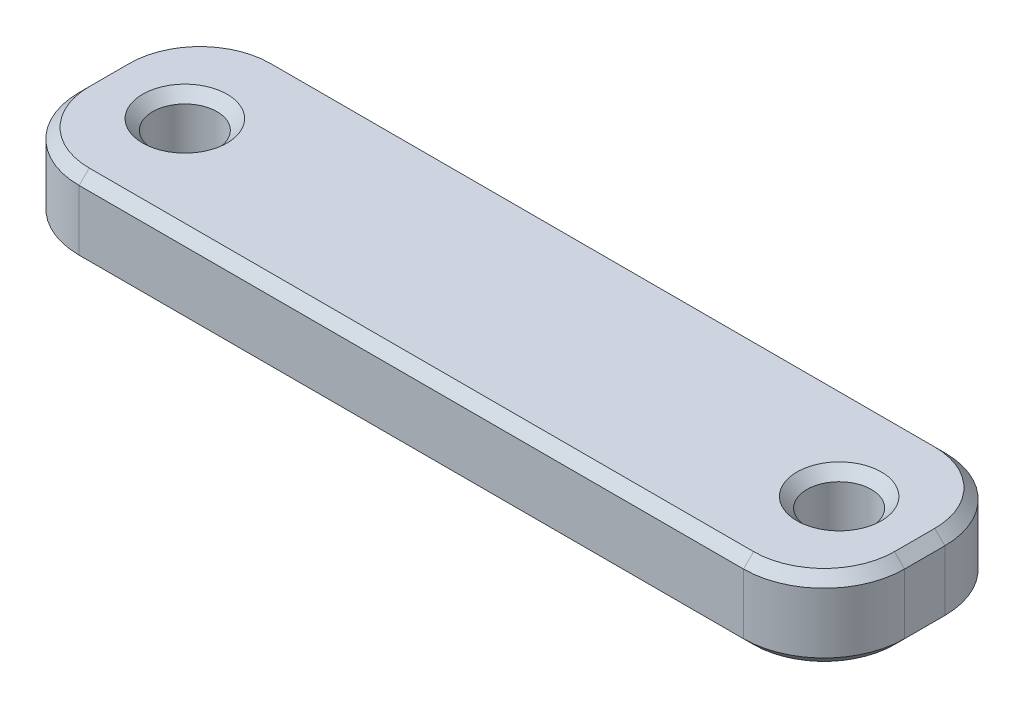
ISO-10303-21;
HEADER;
FILE_DESCRIPTION(('STEP AP214'),'2;1');
FILE_NAME('part.step','',(''),(''),'','','');
FILE_SCHEMA(('AUTOMOTIVE_DESIGN { 1 0 10303 214 1 1 1 1 }'));
ENDSEC;
DATA;
#1=APPLICATION_CONTEXT('core data for automotive mechanical design processes');
#2=APPLICATION_PROTOCOL_DEFINITION('international standard','automotive_design',2000,#1);
#3=PRODUCT_CONTEXT('',#1,'mechanical');
#4=PRODUCT('Part','Part','',(#3));
#5=PRODUCT_RELATED_PRODUCT_CATEGORY('part','',(#4));
#6=PRODUCT_DEFINITION_FORMATION('','',#4);
#7=PRODUCT_DEFINITION_CONTEXT('part definition',#1,'design');
#8=PRODUCT_DEFINITION('design','',#6,#7);
#9=PRODUCT_DEFINITION_SHAPE('','',#8);
#10=(LENGTH_UNIT() NAMED_UNIT(*) SI_UNIT(.MILLI.,.METRE.));
#11=(NAMED_UNIT(*) PLANE_ANGLE_UNIT() SI_UNIT($,.RADIAN.));
#12=(NAMED_UNIT(*) SI_UNIT($,.STERADIAN.) SOLID_ANGLE_UNIT());
#13=UNCERTAINTY_MEASURE_WITH_UNIT(LENGTH_MEASURE(1.E-05),#10,'distance_accuracy_value','');
#14=(GEOMETRIC_REPRESENTATION_CONTEXT(3) GLOBAL_UNCERTAINTY_ASSIGNED_CONTEXT((#13)) GLOBAL_UNIT_ASSIGNED_CONTEXT((#10,
#11,#12)) REPRESENTATION_CONTEXT('',''));
#15=CARTESIAN_POINT('',(0.,0.,0.));
#16=DIRECTION('',(0.,0.,1.));
#17=DIRECTION('',(1.,0.,0.));
#18=AXIS2_PLACEMENT_3D('',#15,#16,#17);
#19=CARTESIAN_POINT('',(0.,4.,0.));
#20=DIRECTION('',(0.,1.,0.));
#21=DIRECTION('',(0.,0.,1.));
#22=AXIS2_PLACEMENT_3D('',#19,#20,#21);
#23=PLANE('',#22);
#24=CARTESIAN_POINT('',(16.25,4.,0.));
#25=DIRECTION('',(0.,1.,0.));
#26=DIRECTION('',(0.,0.,1.));
#27=AXIS2_PLACEMENT_3D('',#24,#25,#26);
#28=CIRCLE('',#27,2.1);
#29=CARTESIAN_POINT('',(16.25,4.,2.1));
#30=VERTEX_POINT('',#29);
#31=EDGE_CURVE('E11',#30,#30,#28,.F.);
#32=ORIENTED_EDGE('',*,*,#31,.T.);
#33=EDGE_LOOP('',(#32));
#34=FACE_BOUND('',#33,.T.);
#35=DIRECTION('',(1.,0.,0.));
#36=VECTOR('',#35,1.);
#37=CARTESIAN_POINT('',(16.5,4.,4.5));
#38=LINE('',#37,#36);
#39=CARTESIAN_POINT('',(-16.5,4.,4.5));
#40=VERTEX_POINT('',#39);
#41=CARTESIAN_POINT('',(16.5,4.,4.5));
#42=VERTEX_POINT('',#41);
#43=EDGE_CURVE('E63',#40,#42,#38,.T.);
#44=ORIENTED_EDGE('',*,*,#43,.T.);
#45=CARTESIAN_POINT('',(16.5,4.,1.));
#46=DIRECTION('',(0.,1.,0.));
#47=DIRECTION('',(0.,0.,1.));
#48=AXIS2_PLACEMENT_3D('',#45,#46,#47);
#49=CIRCLE('',#48,3.5);
#50=CARTESIAN_POINT('',(20.,4.,1.));
#51=VERTEX_POINT('',#50);
#52=EDGE_CURVE('E57',#42,#51,#49,.T.);
#53=ORIENTED_EDGE('',*,*,#52,.T.);
#54=DIRECTION('',(0.,0.,-1.));
#55=VECTOR('',#54,1.);
#56=CARTESIAN_POINT('',(20.,4.,-0.999999999999999));
#57=LINE('',#56,#55);
#58=CARTESIAN_POINT('',(20.,4.,-0.999999999999999));
#59=VERTEX_POINT('',#58);
#60=EDGE_CURVE('E274',#51,#59,#57,.T.);
#61=ORIENTED_EDGE('',*,*,#60,.T.);
#62=CARTESIAN_POINT('',(16.5,4.,-0.999999999999999));
#63=DIRECTION('',(0.,1.,0.));
#64=DIRECTION('',(0.,0.,1.));
#65=AXIS2_PLACEMENT_3D('',#62,#63,#64);
#66=CIRCLE('',#65,3.5);
#67=CARTESIAN_POINT('',(16.5,4.,-4.5));
#68=VERTEX_POINT('',#67);
#69=EDGE_CURVE('E279',#59,#68,#66,.T.);
#70=ORIENTED_EDGE('',*,*,#69,.T.);
#71=DIRECTION('',(-1.,0.,0.));
#72=VECTOR('',#71,1.);
#73=CARTESIAN_POINT('',(-16.5,4.,-4.5));
#74=LINE('',#73,#72);
#75=CARTESIAN_POINT('',(-16.5,4.,-4.5));
#76=VERTEX_POINT('',#75);
#77=EDGE_CURVE('E284',#68,#76,#74,.T.);
#78=ORIENTED_EDGE('',*,*,#77,.T.);
#79=CARTESIAN_POINT('',(-16.5,4.,-0.999999999999999));
#80=DIRECTION('',(0.,1.,0.));
#81=DIRECTION('',(0.,0.,1.));
#82=AXIS2_PLACEMENT_3D('',#79,#80,#81);
#83=CIRCLE('',#82,3.5);
#84=CARTESIAN_POINT('',(-20.,4.,-0.999999999999998));
#85=VERTEX_POINT('',#84);
#86=EDGE_CURVE('E283',#76,#85,#83,.T.);
#87=ORIENTED_EDGE('',*,*,#86,.T.);
#88=DIRECTION('',(0.,0.,1.));
#89=VECTOR('',#88,1.);
#90=CARTESIAN_POINT('',(-20.,4.,1.));
#91=LINE('',#90,#89);
#92=CARTESIAN_POINT('',(-20.,4.,1.));
#93=VERTEX_POINT('',#92);
#94=EDGE_CURVE('E289',#85,#93,#91,.T.);
#95=ORIENTED_EDGE('',*,*,#94,.T.);
#96=CARTESIAN_POINT('',(-16.5,4.,1.));
#97=DIRECTION('',(0.,1.,0.));
#98=DIRECTION('',(0.,0.,1.));
#99=AXIS2_PLACEMENT_3D('',#96,#97,#98);
#100=CIRCLE('',#99,3.5);
#101=EDGE_CURVE('E66',#93,#40,#100,.T.);
#102=ORIENTED_EDGE('',*,*,#101,.T.);
#103=EDGE_LOOP('',(#44,#53,#61,#70,#78,#87,#95,#102));
#104=FACE_BOUND('',#103,.T.);
#105=CARTESIAN_POINT('',(-16.25,4.,0.));
#106=DIRECTION('',(0.,1.,0.));
#107=DIRECTION('',(0.,0.,1.));
#108=AXIS2_PLACEMENT_3D('',#105,#106,#107);
#109=CIRCLE('',#108,2.10000000000002);
#110=CARTESIAN_POINT('',(-16.25,4.,2.10000000000002));
#111=VERTEX_POINT('',#110);
#112=EDGE_CURVE('E271',#111,#111,#109,.F.);
#113=ORIENTED_EDGE('',*,*,#112,.T.);
#114=EDGE_LOOP('',(#113));
#115=FACE_BOUND('',#114,.T.);
#116=ADVANCED_FACE('F44',(#34,#104,#115),#23,.T.);
#117=CARTESIAN_POINT('',(0.,0.,0.));
#118=DIRECTION('',(0.,1.,0.));
#119=DIRECTION('',(0.,0.,1.));
#120=AXIS2_PLACEMENT_3D('',#117,#118,#119);
#121=PLANE('',#120);
#122=CARTESIAN_POINT('',(16.25,0.,0.));
#123=DIRECTION('',(0.,1.,0.));
#124=DIRECTION('',(0.,0.,1.));
#125=AXIS2_PLACEMENT_3D('',#122,#123,#124);
#126=CIRCLE('',#125,2.1);
#127=CARTESIAN_POINT('',(16.25,0.,2.1));
#128=VERTEX_POINT('',#127);
#129=EDGE_CURVE('E197',#128,#128,#126,.T.);
#130=ORIENTED_EDGE('',*,*,#129,.T.);
#131=EDGE_LOOP('',(#130));
#132=FACE_BOUND('',#131,.T.);
#133=CARTESIAN_POINT('',(-16.25,0.,0.));
#134=DIRECTION('',(0.,1.,0.));
#135=DIRECTION('',(0.,0.,1.));
#136=AXIS2_PLACEMENT_3D('',#133,#134,#135);
#137=CIRCLE('',#136,2.1);
#138=CARTESIAN_POINT('',(-16.25,0.,2.1));
#139=VERTEX_POINT('',#138);
#140=EDGE_CURVE('E192',#139,#139,#137,.T.);
#141=ORIENTED_EDGE('',*,*,#140,.T.);
#142=EDGE_LOOP('',(#141));
#143=FACE_BOUND('',#142,.T.);
#144=DIRECTION('',(0.,0.,-1.));
#145=VECTOR('',#144,1.);
#146=CARTESIAN_POINT('',(-20.,0.,0.));
#147=LINE('',#146,#145);
#148=CARTESIAN_POINT('',(-20.,0.,1.));
#149=VERTEX_POINT('',#148);
#150=CARTESIAN_POINT('',(-20.,0.,-0.999999999999998));
#151=VERTEX_POINT('',#150);
#152=EDGE_CURVE('E190',#149,#151,#147,.T.);
#153=ORIENTED_EDGE('',*,*,#152,.T.);
#154=CARTESIAN_POINT('',(-16.5,0.,-0.999999999999999));
#155=DIRECTION('',(0.,1.,0.));
#156=DIRECTION('',(0.,0.,1.));
#157=AXIS2_PLACEMENT_3D('',#154,#155,#156);
#158=CIRCLE('',#157,3.5);
#159=CARTESIAN_POINT('',(-16.5,0.,-4.5));
#160=VERTEX_POINT('',#159);
#161=EDGE_CURVE('E170',#151,#160,#158,.F.);
#162=ORIENTED_EDGE('',*,*,#161,.T.);
#163=DIRECTION('',(1.,0.,0.));
#164=VECTOR('',#163,1.);
#165=CARTESIAN_POINT('',(0.,0.,-4.5));
#166=LINE('',#165,#164);
#167=CARTESIAN_POINT('',(16.5,0.,-4.5));
#168=VERTEX_POINT('',#167);
#169=EDGE_CURVE('E177',#160,#168,#166,.T.);
#170=ORIENTED_EDGE('',*,*,#169,.T.);
#171=CARTESIAN_POINT('',(16.5,0.,-0.999999999999999));
#172=DIRECTION('',(0.,1.,0.));
#173=DIRECTION('',(0.,0.,1.));
#174=AXIS2_PLACEMENT_3D('',#171,#172,#173);
#175=CIRCLE('',#174,3.5);
#176=CARTESIAN_POINT('',(20.,0.,-0.999999999999999));
#177=VERTEX_POINT('',#176);
#178=EDGE_CURVE('E181',#168,#177,#175,.F.);
#179=ORIENTED_EDGE('',*,*,#178,.T.);
#180=DIRECTION('',(0.,0.,1.));
#181=VECTOR('',#180,1.);
#182=CARTESIAN_POINT('',(20.,0.,0.));
#183=LINE('',#182,#181);
#184=CARTESIAN_POINT('',(20.,0.,1.));
#185=VERTEX_POINT('',#184);
#186=EDGE_CURVE('E398',#177,#185,#183,.T.);
#187=ORIENTED_EDGE('',*,*,#186,.T.);
#188=CARTESIAN_POINT('',(16.5,0.,1.));
#189=DIRECTION('',(0.,1.,0.));
#190=DIRECTION('',(0.,0.,1.));
#191=AXIS2_PLACEMENT_3D('',#188,#189,#190);
#192=CIRCLE('',#191,3.5);
#193=CARTESIAN_POINT('',(16.5,0.,4.5));
#194=VERTEX_POINT('',#193);
#195=EDGE_CURVE('E401',#185,#194,#192,.F.);
#196=ORIENTED_EDGE('',*,*,#195,.T.);
#197=DIRECTION('',(-1.,0.,0.));
#198=VECTOR('',#197,1.);
#199=CARTESIAN_POINT('',(0.,0.,4.5));
#200=LINE('',#199,#198);
#201=CARTESIAN_POINT('',(-16.5,0.,4.5));
#202=VERTEX_POINT('',#201);
#203=EDGE_CURVE('E409',#194,#202,#200,.T.);
#204=ORIENTED_EDGE('',*,*,#203,.T.);
#205=CARTESIAN_POINT('',(-16.5,0.,1.));
#206=DIRECTION('',(0.,1.,0.));
#207=DIRECTION('',(0.,0.,1.));
#208=AXIS2_PLACEMENT_3D('',#205,#206,#207);
#209=CIRCLE('',#208,3.5);
#210=EDGE_CURVE('E199',#202,#149,#209,.F.);
#211=ORIENTED_EDGE('',*,*,#210,.T.);
#212=EDGE_LOOP('',(#153,#162,#170,#179,#187,#196,#204,#211));
#213=FACE_BOUND('',#212,.T.);
#214=ADVANCED_FACE('F189',(#132,#143,#213),#121,.F.);
#215=CARTESIAN_POINT('',(20.5,4.,-5.));
#216=DIRECTION('',(-1.,0.,0.));
#217=DIRECTION('',(0.,0.,1.));
#218=AXIS2_PLACEMENT_3D('',#215,#216,#217);
#219=PLANE('',#218);
#220=DIRECTION('',(0.,-1.,0.));
#221=VECTOR('',#220,1.);
#222=CARTESIAN_POINT('',(20.5,4.,1.));
#223=LINE('',#222,#221);
#224=CARTESIAN_POINT('',(20.5,3.5,1.));
#225=VERTEX_POINT('',#224);
#226=CARTESIAN_POINT('',(20.5,0.5,1.));
#227=VERTEX_POINT('',#226);
#228=EDGE_CURVE('E376',#225,#227,#223,.T.);
#229=ORIENTED_EDGE('',*,*,#228,.T.);
#230=DIRECTION('',(0.,0.,-1.));
#231=VECTOR('',#230,1.);
#232=CARTESIAN_POINT('',(20.5,0.5,-5.));
#233=LINE('',#232,#231);
#234=CARTESIAN_POINT('',(20.5,0.5,-0.999999999999999));
#235=VERTEX_POINT('',#234);
#236=EDGE_CURVE('E258',#227,#235,#233,.T.);
#237=ORIENTED_EDGE('',*,*,#236,.T.);
#238=DIRECTION('',(0.,-1.,0.));
#239=VECTOR('',#238,1.);
#240=CARTESIAN_POINT('',(20.5,4.,-0.999999999999999));
#241=LINE('',#240,#239);
#242=CARTESIAN_POINT('',(20.5,3.5,-0.999999999999999));
#243=VERTEX_POINT('',#242);
#244=EDGE_CURVE('E385',#235,#243,#241,.F.);
#245=ORIENTED_EDGE('',*,*,#244,.T.);
#246=DIRECTION('',(0.,0.,1.));
#247=VECTOR('',#246,1.);
#248=CARTESIAN_POINT('',(20.5,3.5,1.));
#249=LINE('',#248,#247);
#250=EDGE_CURVE('E251',#243,#225,#249,.T.);
#251=ORIENTED_EDGE('',*,*,#250,.T.);
#252=EDGE_LOOP('',(#229,#237,#245,#251));
#253=FACE_BOUND('',#252,.T.);
#254=ADVANCED_FACE('F450',(#253),#219,.F.);
#255=CARTESIAN_POINT('',(-20.5,4.,-5.));
#256=DIRECTION('',(0.,0.,1.));
#257=DIRECTION('',(1.,0.,0.));
#258=AXIS2_PLACEMENT_3D('',#255,#256,#257);
#259=PLANE('',#258);
#260=DIRECTION('',(0.,-1.,0.));
#261=VECTOR('',#260,1.);
#262=CARTESIAN_POINT('',(16.5,4.,-5.));
#263=LINE('',#262,#261);
#264=CARTESIAN_POINT('',(16.5,3.5,-5.));
#265=VERTEX_POINT('',#264);
#266=CARTESIAN_POINT('',(16.5,0.5,-5.));
#267=VERTEX_POINT('',#266);
#268=EDGE_CURVE('E373',#265,#267,#263,.T.);
#269=ORIENTED_EDGE('',*,*,#268,.T.);
#270=DIRECTION('',(-1.,0.,0.));
#271=VECTOR('',#270,1.);
#272=CARTESIAN_POINT('',(-20.5,0.5,-5.));
#273=LINE('',#272,#271);
#274=CARTESIAN_POINT('',(-16.5,0.5,-5.));
#275=VERTEX_POINT('',#274);
#276=EDGE_CURVE('E268',#267,#275,#273,.T.);
#277=ORIENTED_EDGE('',*,*,#276,.T.);
#278=DIRECTION('',(0.,-1.,0.));
#279=VECTOR('',#278,1.);
#280=CARTESIAN_POINT('',(-16.5,4.,-5.));
#281=LINE('',#280,#279);
#282=CARTESIAN_POINT('',(-16.5,3.5,-5.));
#283=VERTEX_POINT('',#282);
#284=EDGE_CURVE('E317',#275,#283,#281,.F.);
#285=ORIENTED_EDGE('',*,*,#284,.T.);
#286=DIRECTION('',(1.,0.,0.));
#287=VECTOR('',#286,1.);
#288=CARTESIAN_POINT('',(16.5,3.5,-5.));
#289=LINE('',#288,#287);
#290=EDGE_CURVE('E264',#283,#265,#289,.T.);
#291=ORIENTED_EDGE('',*,*,#290,.T.);
#292=EDGE_LOOP('',(#269,#277,#285,#291));
#293=FACE_BOUND('',#292,.T.);
#294=ADVANCED_FACE('F367',(#293),#259,.F.);
#295=CARTESIAN_POINT('',(-20.5,4.,-5.));
#296=DIRECTION('',(1.,0.,0.));
#297=DIRECTION('',(0.,0.,-1.));
#298=AXIS2_PLACEMENT_3D('',#295,#296,#297);
#299=PLANE('',#298);
#300=DIRECTION('',(0.,-1.,0.));
#301=VECTOR('',#300,1.);
#302=CARTESIAN_POINT('',(-20.5,4.,-0.999999999999997));
#303=LINE('',#302,#301);
#304=CARTESIAN_POINT('',(-20.5,3.5,-0.999999999999997));
#305=VERTEX_POINT('',#304);
#306=CARTESIAN_POINT('',(-20.5,0.5,-0.999999999999997));
#307=VERTEX_POINT('',#306);
#308=EDGE_CURVE('E370',#305,#307,#303,.T.);
#309=ORIENTED_EDGE('',*,*,#308,.T.);
#310=DIRECTION('',(0.,0.,1.));
#311=VECTOR('',#310,1.);
#312=CARTESIAN_POINT('',(-20.5,0.5,-5.));
#313=LINE('',#312,#311);
#314=CARTESIAN_POINT('',(-20.5,0.5,1.));
#315=VERTEX_POINT('',#314);
#316=EDGE_CURVE('E232',#307,#315,#313,.T.);
#317=ORIENTED_EDGE('',*,*,#316,.T.);
#318=DIRECTION('',(0.,-1.,0.));
#319=VECTOR('',#318,1.);
#320=CARTESIAN_POINT('',(-20.5,4.,1.));
#321=LINE('',#320,#319);
#322=CARTESIAN_POINT('',(-20.5,3.5,1.));
#323=VERTEX_POINT('',#322);
#324=EDGE_CURVE('E184',#315,#323,#321,.F.);
#325=ORIENTED_EDGE('',*,*,#324,.T.);
#326=DIRECTION('',(0.,0.,-1.));
#327=VECTOR('',#326,1.);
#328=CARTESIAN_POINT('',(-20.5,3.5,-0.999999999999997));
#329=LINE('',#328,#327);
#330=EDGE_CURVE('E230',#323,#305,#329,.T.);
#331=ORIENTED_EDGE('',*,*,#330,.T.);
#332=EDGE_LOOP('',(#309,#317,#325,#331));
#333=FACE_BOUND('',#332,.T.);
#334=ADVANCED_FACE('F419',(#333),#299,.F.);
#335=CARTESIAN_POINT('',(-20.5,4.,5.));
#336=DIRECTION('',(0.,0.,-1.));
#337=DIRECTION('',(-1.,0.,0.));
#338=AXIS2_PLACEMENT_3D('',#335,#336,#337);
#339=PLANE('',#338);
#340=DIRECTION('',(0.,-1.,0.));
#341=VECTOR('',#340,1.);
#342=CARTESIAN_POINT('',(-16.5,4.,5.));
#343=LINE('',#342,#341);
#344=CARTESIAN_POINT('',(-16.5,3.5,5.));
#345=VERTEX_POINT('',#344);
#346=CARTESIAN_POINT('',(-16.5,0.5,5.));
#347=VERTEX_POINT('',#346);
#348=EDGE_CURVE('E387',#345,#347,#343,.T.);
#349=ORIENTED_EDGE('',*,*,#348,.T.);
#350=DIRECTION('',(1.,0.,0.));
#351=VECTOR('',#350,1.);
#352=CARTESIAN_POINT('',(-20.5,0.5,5.));
#353=LINE('',#352,#351);
#354=CARTESIAN_POINT('',(16.5,0.5,5.));
#355=VERTEX_POINT('',#354);
#356=EDGE_CURVE('E245',#347,#355,#353,.T.);
#357=ORIENTED_EDGE('',*,*,#356,.T.);
#358=DIRECTION('',(0.,-1.,0.));
#359=VECTOR('',#358,1.);
#360=CARTESIAN_POINT('',(16.5,4.,5.));
#361=LINE('',#360,#359);
#362=CARTESIAN_POINT('',(16.5,3.5,5.));
#363=VERTEX_POINT('',#362);
#364=EDGE_CURVE('E386',#355,#363,#361,.F.);
#365=ORIENTED_EDGE('',*,*,#364,.T.);
#366=DIRECTION('',(-1.,0.,0.));
#367=VECTOR('',#366,1.);
#368=CARTESIAN_POINT('',(-16.5,3.5,5.));
#369=LINE('',#368,#367);
#370=EDGE_CURVE('E238',#363,#345,#369,.T.);
#371=ORIENTED_EDGE('',*,*,#370,.T.);
#372=EDGE_LOOP('',(#349,#357,#365,#371));
#373=FACE_BOUND('',#372,.T.);
#374=ADVANCED_FACE('F463',(#373),#339,.F.);
#375=CARTESIAN_POINT('',(-16.25,4.,0.));
#376=DIRECTION('',(0.,-1.,0.));
#377=DIRECTION('',(0.,0.,-1.));
#378=AXIS2_PLACEMENT_3D('',#375,#376,#377);
#379=CYLINDRICAL_SURFACE('',#378,1.6);
#380=CARTESIAN_POINT('',(-16.25,0.500000000000004,0.));
#381=DIRECTION('',(0.,1.,0.));
#382=DIRECTION('',(0.,0.,1.));
#383=AXIS2_PLACEMENT_3D('',#380,#381,#382);
#384=CIRCLE('',#383,1.6);
#385=CARTESIAN_POINT('',(-16.25,0.500000000000004,1.6));
#386=VERTEX_POINT('',#385);
#387=EDGE_CURVE('E218',#386,#386,#384,.F.);
#388=ORIENTED_EDGE('',*,*,#387,.T.);
#389=EDGE_LOOP('',(#388));
#390=FACE_BOUND('',#389,.T.);
#391=CARTESIAN_POINT('',(-16.25,3.49999999999999,0.));
#392=DIRECTION('',(0.,1.,0.));
#393=DIRECTION('',(0.,0.,1.));
#394=AXIS2_PLACEMENT_3D('',#391,#392,#393);
#395=CIRCLE('',#394,1.6);
#396=CARTESIAN_POINT('',(-16.25,3.49999999999999,1.6));
#397=VERTEX_POINT('',#396);
#398=EDGE_CURVE('E214',#397,#397,#395,.T.);
#399=ORIENTED_EDGE('',*,*,#398,.T.);
#400=EDGE_LOOP('',(#399));
#401=FACE_BOUND('',#400,.T.);
#402=ADVANCED_FACE('F467',(#390,#401),#379,.F.);
#403=CARTESIAN_POINT('',(16.25,4.,0.));
#404=DIRECTION('',(0.,-1.,0.));
#405=DIRECTION('',(0.,0.,-1.));
#406=AXIS2_PLACEMENT_3D('',#403,#404,#405);
#407=CYLINDRICAL_SURFACE('',#406,1.6);
#408=CARTESIAN_POINT('',(16.25,0.500000000000004,0.));
#409=DIRECTION('',(0.,1.,0.));
#410=DIRECTION('',(0.,0.,1.));
#411=AXIS2_PLACEMENT_3D('',#408,#409,#410);
#412=CIRCLE('',#411,1.6);
#413=CARTESIAN_POINT('',(16.25,0.500000000000004,1.6));
#414=VERTEX_POINT('',#413);
#415=EDGE_CURVE('E211',#414,#414,#412,.F.);
#416=ORIENTED_EDGE('',*,*,#415,.T.);
#417=EDGE_LOOP('',(#416));
#418=FACE_BOUND('',#417,.T.);
#419=CARTESIAN_POINT('',(16.25,3.5,0.));
#420=DIRECTION('',(0.,1.,0.));
#421=DIRECTION('',(0.,0.,1.));
#422=AXIS2_PLACEMENT_3D('',#419,#420,#421);
#423=CIRCLE('',#422,1.6);
#424=CARTESIAN_POINT('',(16.25,3.5,1.6));
#425=VERTEX_POINT('',#424);
#426=EDGE_CURVE('E210',#425,#425,#423,.T.);
#427=ORIENTED_EDGE('',*,*,#426,.T.);
#428=EDGE_LOOP('',(#427));
#429=FACE_BOUND('',#428,.T.);
#430=ADVANCED_FACE('F473',(#418,#429),#407,.F.);
#431=CARTESIAN_POINT('',(16.5,4.,-0.999999999999999));
#432=DIRECTION('',(0.,-1.,0.));
#433=DIRECTION('',(0.,0.,-1.));
#434=AXIS2_PLACEMENT_3D('',#431,#432,#433);
#435=CYLINDRICAL_SURFACE('',#434,4.);
#436=ORIENTED_EDGE('',*,*,#244,.F.);
#437=CARTESIAN_POINT('',(16.5,0.5,-0.999999999999999));
#438=DIRECTION('',(0.,1.,0.));
#439=DIRECTION('',(0.,0.,1.));
#440=AXIS2_PLACEMENT_3D('',#437,#438,#439);
#441=CIRCLE('',#440,4.);
#442=EDGE_CURVE('E265',#235,#267,#441,.T.);
#443=ORIENTED_EDGE('',*,*,#442,.T.);
#444=ORIENTED_EDGE('',*,*,#268,.F.);
#445=CARTESIAN_POINT('',(16.5,3.5,-0.999999999999999));
#446=DIRECTION('',(0.,1.,0.));
#447=DIRECTION('',(0.,0.,1.));
#448=AXIS2_PLACEMENT_3D('',#445,#446,#447);
#449=CIRCLE('',#448,4.);
#450=EDGE_CURVE('E259',#265,#243,#449,.F.);
#451=ORIENTED_EDGE('',*,*,#450,.T.);
#452=EDGE_LOOP('',(#436,#443,#444,#451));
#453=FACE_BOUND('',#452,.T.);
#454=ADVANCED_FACE('F482',(#453),#435,.T.);
#455=CARTESIAN_POINT('',(16.5,4.,1.));
#456=DIRECTION('',(0.,-1.,0.));
#457=DIRECTION('',(0.,0.,-1.));
#458=AXIS2_PLACEMENT_3D('',#455,#456,#457);
#459=CYLINDRICAL_SURFACE('',#458,4.);
#460=ORIENTED_EDGE('',*,*,#364,.F.);
#461=CARTESIAN_POINT('',(16.5,0.5,1.));
#462=DIRECTION('',(0.,1.,0.));
#463=DIRECTION('',(0.,0.,1.));
#464=AXIS2_PLACEMENT_3D('',#461,#462,#463);
#465=CIRCLE('',#464,4.);
#466=EDGE_CURVE('E248',#355,#227,#465,.T.);
#467=ORIENTED_EDGE('',*,*,#466,.T.);
#468=ORIENTED_EDGE('',*,*,#228,.F.);
#469=CARTESIAN_POINT('',(16.5,3.5,1.));
#470=DIRECTION('',(0.,1.,0.));
#471=DIRECTION('',(0.,0.,1.));
#472=AXIS2_PLACEMENT_3D('',#469,#470,#471);
#473=CIRCLE('',#472,4.);
#474=EDGE_CURVE('E247',#225,#363,#473,.F.);
#475=ORIENTED_EDGE('',*,*,#474,.T.);
#476=EDGE_LOOP('',(#460,#467,#468,#475));
#477=FACE_BOUND('',#476,.T.);
#478=ADVANCED_FACE('F455',(#477),#459,.T.);
#479=CARTESIAN_POINT('',(-16.5,4.,1.));
#480=DIRECTION('',(0.,-1.,0.));
#481=DIRECTION('',(0.,0.,-1.));
#482=AXIS2_PLACEMENT_3D('',#479,#480,#481);
#483=CYLINDRICAL_SURFACE('',#482,4.);
#484=ORIENTED_EDGE('',*,*,#324,.F.);
#485=CARTESIAN_POINT('',(-16.5,0.5,1.));
#486=DIRECTION('',(0.,1.,0.));
#487=DIRECTION('',(0.,0.,1.));
#488=AXIS2_PLACEMENT_3D('',#485,#486,#487);
#489=CIRCLE('',#488,4.);
#490=EDGE_CURVE('E240',#315,#347,#489,.T.);
#491=ORIENTED_EDGE('',*,*,#490,.T.);
#492=ORIENTED_EDGE('',*,*,#348,.F.);
#493=CARTESIAN_POINT('',(-16.5,3.5,1.));
#494=DIRECTION('',(0.,1.,0.));
#495=DIRECTION('',(0.,0.,1.));
#496=AXIS2_PLACEMENT_3D('',#493,#494,#495);
#497=CIRCLE('',#496,4.);
#498=EDGE_CURVE('E231',#345,#323,#497,.F.);
#499=ORIENTED_EDGE('',*,*,#498,.T.);
#500=EDGE_LOOP('',(#484,#491,#492,#499));
#501=FACE_BOUND('',#500,.T.);
#502=ADVANCED_FACE('F425',(#501),#483,.T.);
#503=CARTESIAN_POINT('',(-16.5,4.,-0.999999999999999));
#504=DIRECTION('',(0.,-1.,0.));
#505=DIRECTION('',(0.,0.,-1.));
#506=AXIS2_PLACEMENT_3D('',#503,#504,#505);
#507=CYLINDRICAL_SURFACE('',#506,4.);
#508=ORIENTED_EDGE('',*,*,#284,.F.);
#509=CARTESIAN_POINT('',(-16.5,0.5,-0.999999999999999));
#510=DIRECTION('',(0.,1.,0.));
#511=DIRECTION('',(0.,0.,1.));
#512=AXIS2_PLACEMENT_3D('',#509,#510,#511);
#513=CIRCLE('',#512,4.);
#514=EDGE_CURVE('E166',#275,#307,#513,.T.);
#515=ORIENTED_EDGE('',*,*,#514,.T.);
#516=ORIENTED_EDGE('',*,*,#308,.F.);
#517=CARTESIAN_POINT('',(-16.5,3.5,-0.999999999999999));
#518=DIRECTION('',(0.,1.,0.));
#519=DIRECTION('',(0.,0.,1.));
#520=AXIS2_PLACEMENT_3D('',#517,#518,#519);
#521=CIRCLE('',#520,4.);
#522=EDGE_CURVE('E224',#305,#283,#521,.F.);
#523=ORIENTED_EDGE('',*,*,#522,.T.);
#524=EDGE_LOOP('',(#508,#515,#516,#523));
#525=FACE_BOUND('',#524,.T.);
#526=ADVANCED_FACE('F364',(#525),#507,.T.);
#527=CARTESIAN_POINT('',(16.25,0.,0.));
#528=DIRECTION('',(0.,-1.,0.));
#529=DIRECTION('',(0.,0.,-1.));
#530=AXIS2_PLACEMENT_3D('',#527,#528,#529);
#531=CONICAL_SURFACE('',#530,2.1,0.785398163397443);
#532=ORIENTED_EDGE('',*,*,#415,.F.);
#533=EDGE_LOOP('',(#532));
#534=FACE_BOUND('',#533,.T.);
#535=ORIENTED_EDGE('',*,*,#129,.F.);
#536=EDGE_LOOP('',(#535));
#537=FACE_BOUND('',#536,.T.);
#538=ADVANCED_FACE('F697',(#534,#537),#531,.F.);
#539=CARTESIAN_POINT('',(-16.25,0.,0.));
#540=DIRECTION('',(0.,-1.,0.));
#541=DIRECTION('',(0.,0.,-1.));
#542=AXIS2_PLACEMENT_3D('',#539,#540,#541);
#543=CONICAL_SURFACE('',#542,2.1,0.785398163397443);
#544=ORIENTED_EDGE('',*,*,#387,.F.);
#545=EDGE_LOOP('',(#544));
#546=FACE_BOUND('',#545,.T.);
#547=ORIENTED_EDGE('',*,*,#140,.F.);
#548=EDGE_LOOP('',(#547));
#549=FACE_BOUND('',#548,.T.);
#550=ADVANCED_FACE('F693',(#546,#549),#543,.F.);
#551=CARTESIAN_POINT('',(16.5,0.,1.));
#552=DIRECTION('',(0.,1.,0.));
#553=DIRECTION('',(0.,0.,1.));
#554=AXIS2_PLACEMENT_3D('',#551,#552,#553);
#555=CONICAL_SURFACE('',#554,3.5,0.785398163397452);
#556=DIRECTION('',(-0.70710678118655,-0.707106781186545,0.));
#557=VECTOR('',#556,1.);
#558=CARTESIAN_POINT('',(20.5,0.5,1.));
#559=LINE('',#558,#557);
#560=EDGE_CURVE('E313',#227,#185,#559,.T.);
#561=ORIENTED_EDGE('',*,*,#560,.F.);
#562=ORIENTED_EDGE('',*,*,#466,.F.);
#563=DIRECTION('',(0.,0.707106781186545,0.70710678118655));
#564=VECTOR('',#563,1.);
#565=CARTESIAN_POINT('',(16.5,0.,4.5));
#566=LINE('',#565,#564);
#567=EDGE_CURVE('E312',#194,#355,#566,.T.);
#568=ORIENTED_EDGE('',*,*,#567,.F.);
#569=ORIENTED_EDGE('',*,*,#195,.F.);
#570=EDGE_LOOP('',(#561,#562,#568,#569));
#571=FACE_BOUND('',#570,.T.);
#572=ADVANCED_FACE('F460',(#571),#555,.T.);
#573=CARTESIAN_POINT('',(-20.5,0.5,5.));
#574=DIRECTION('',(0.,0.70710678118655,-0.707106781186545));
#575=DIRECTION('',(1.,0.,0.));
#576=AXIS2_PLACEMENT_3D('',#573,#574,#575);
#577=PLANE('',#576);
#578=ORIENTED_EDGE('',*,*,#567,.T.);
#579=ORIENTED_EDGE('',*,*,#356,.F.);
#580=DIRECTION('',(0.,0.707106781186545,0.70710678118655));
#581=VECTOR('',#580,1.);
#582=CARTESIAN_POINT('',(-16.5,0.,4.5));
#583=LINE('',#582,#581);
#584=EDGE_CURVE('E307',#202,#347,#583,.T.);
#585=ORIENTED_EDGE('',*,*,#584,.F.);
#586=ORIENTED_EDGE('',*,*,#203,.F.);
#587=EDGE_LOOP('',(#578,#579,#585,#586));
#588=FACE_BOUND('',#587,.T.);
#589=ADVANCED_FACE('F461',(#588),#577,.F.);
#590=CARTESIAN_POINT('',(20.5,0.5,-5.));
#591=DIRECTION('',(-0.707106781186545,0.70710678118655,0.));
#592=DIRECTION('',(0.,0.,-1.));
#593=AXIS2_PLACEMENT_3D('',#590,#591,#592);
#594=PLANE('',#593);
#595=ORIENTED_EDGE('',*,*,#560,.T.);
#596=ORIENTED_EDGE('',*,*,#186,.F.);
#597=DIRECTION('',(-0.70710678118655,-0.707106781186545,0.));
#598=VECTOR('',#597,1.);
#599=CARTESIAN_POINT('',(20.5,0.5,-0.999999999999999));
#600=LINE('',#599,#598);
#601=EDGE_CURVE('E305',#235,#177,#600,.T.);
#602=ORIENTED_EDGE('',*,*,#601,.F.);
#603=ORIENTED_EDGE('',*,*,#236,.F.);
#604=EDGE_LOOP('',(#595,#596,#602,#603));
#605=FACE_BOUND('',#604,.T.);
#606=ADVANCED_FACE('F664',(#605),#594,.F.);
#607=CARTESIAN_POINT('',(-16.5,0.,1.));
#608=DIRECTION('',(0.,1.,0.));
#609=DIRECTION('',(0.,0.,1.));
#610=AXIS2_PLACEMENT_3D('',#607,#608,#609);
#611=CONICAL_SURFACE('',#610,3.5,0.785398163397452);
#612=ORIENTED_EDGE('',*,*,#584,.T.);
#613=ORIENTED_EDGE('',*,*,#490,.F.);
#614=DIRECTION('',(-0.70710678118655,0.707106781186545,0.));
#615=VECTOR('',#614,1.);
#616=CARTESIAN_POINT('',(-20.,0.,1.));
#617=LINE('',#616,#615);
#618=EDGE_CURVE('E297',#149,#315,#617,.T.);
#619=ORIENTED_EDGE('',*,*,#618,.F.);
#620=ORIENTED_EDGE('',*,*,#210,.F.);
#621=EDGE_LOOP('',(#612,#613,#619,#620));
#622=FACE_BOUND('',#621,.T.);
#623=ADVANCED_FACE('F411',(#622),#611,.T.);
#624=CARTESIAN_POINT('',(16.5,0.,-0.999999999999999));
#625=DIRECTION('',(0.,1.,0.));
#626=DIRECTION('',(0.,0.,1.));
#627=AXIS2_PLACEMENT_3D('',#624,#625,#626);
#628=CONICAL_SURFACE('',#627,3.5,0.785398163397452);
#629=ORIENTED_EDGE('',*,*,#601,.T.);
#630=ORIENTED_EDGE('',*,*,#178,.F.);
#631=DIRECTION('',(0.,-0.707106781186545,0.70710678118655));
#632=VECTOR('',#631,1.);
#633=CARTESIAN_POINT('',(16.5,0.5,-5.));
#634=LINE('',#633,#632);
#635=EDGE_CURVE('E176',#267,#168,#634,.T.);
#636=ORIENTED_EDGE('',*,*,#635,.F.);
#637=ORIENTED_EDGE('',*,*,#442,.F.);
#638=EDGE_LOOP('',(#629,#630,#636,#637));
#639=FACE_BOUND('',#638,.T.);
#640=ADVANCED_FACE('F641',(#639),#628,.T.);
#641=CARTESIAN_POINT('',(-20.5,0.5,-5.));
#642=DIRECTION('',(0.707106781186546,0.707106781186549,0.));
#643=DIRECTION('',(0.,0.,1.));
#644=AXIS2_PLACEMENT_3D('',#641,#642,#643);
#645=PLANE('',#644);
#646=ORIENTED_EDGE('',*,*,#618,.T.);
#647=ORIENTED_EDGE('',*,*,#316,.F.);
#648=DIRECTION('',(-0.70710678118655,0.707106781186545,0.));
#649=VECTOR('',#648,1.);
#650=CARTESIAN_POINT('',(-20.,0.,-0.999999999999998));
#651=LINE('',#650,#649);
#652=EDGE_CURVE('E175',#151,#307,#651,.T.);
#653=ORIENTED_EDGE('',*,*,#652,.F.);
#654=ORIENTED_EDGE('',*,*,#152,.F.);
#655=EDGE_LOOP('',(#646,#647,#653,#654));
#656=FACE_BOUND('',#655,.T.);
#657=ADVANCED_FACE('F417',(#656),#645,.F.);
#658=CARTESIAN_POINT('',(-20.5,0.5,-5.));
#659=DIRECTION('',(0.,0.70710678118655,0.707106781186545));
#660=DIRECTION('',(-1.,0.,0.));
#661=AXIS2_PLACEMENT_3D('',#658,#659,#660);
#662=PLANE('',#661);
#663=ORIENTED_EDGE('',*,*,#635,.T.);
#664=ORIENTED_EDGE('',*,*,#169,.F.);
#665=DIRECTION('',(0.,-0.707106781186545,0.70710678118655));
#666=VECTOR('',#665,1.);
#667=CARTESIAN_POINT('',(-16.5,0.5,-5.));
#668=LINE('',#667,#666);
#669=EDGE_CURVE('E162',#275,#160,#668,.T.);
#670=ORIENTED_EDGE('',*,*,#669,.F.);
#671=ORIENTED_EDGE('',*,*,#276,.F.);
#672=EDGE_LOOP('',(#663,#664,#670,#671));
#673=FACE_BOUND('',#672,.T.);
#674=ADVANCED_FACE('F179',(#673),#662,.F.);
#675=CARTESIAN_POINT('',(-16.5,0.,-0.999999999999999));
#676=DIRECTION('',(0.,1.,0.));
#677=DIRECTION('',(0.,0.,1.));
#678=AXIS2_PLACEMENT_3D('',#675,#676,#677);
#679=CONICAL_SURFACE('',#678,3.5,0.785398163397452);
#680=ORIENTED_EDGE('',*,*,#652,.T.);
#681=ORIENTED_EDGE('',*,*,#514,.F.);
#682=ORIENTED_EDGE('',*,*,#669,.T.);
#683=ORIENTED_EDGE('',*,*,#161,.F.);
#684=EDGE_LOOP('',(#680,#681,#682,#683));
#685=FACE_BOUND('',#684,.T.);
#686=ADVANCED_FACE('F164',(#685),#679,.T.);
#687=CARTESIAN_POINT('',(16.25,3.5,0.));
#688=DIRECTION('',(0.,1.,0.));
#689=DIRECTION('',(0.,0.,1.));
#690=AXIS2_PLACEMENT_3D('',#687,#688,#689);
#691=CONICAL_SURFACE('',#690,1.6,0.78539816339745);
#692=ORIENTED_EDGE('',*,*,#31,.F.);
#693=EDGE_LOOP('',(#692));
#694=FACE_BOUND('',#693,.T.);
#695=ORIENTED_EDGE('',*,*,#426,.F.);
#696=EDGE_LOOP('',(#695));
#697=FACE_BOUND('',#696,.T.);
#698=ADVANCED_FACE('F493',(#694,#697),#691,.F.);
#699=CARTESIAN_POINT('',(-16.5,4.,-0.999999999999999));
#700=DIRECTION('',(0.,-1.,0.));
#701=DIRECTION('',(0.,0.,-1.));
#702=AXIS2_PLACEMENT_3D('',#699,#700,#701);
#703=CONICAL_SURFACE('',#702,3.5,0.785398163397445);
#704=DIRECTION('',(0.,0.70710678118655,0.707106781186545));
#705=VECTOR('',#704,1.);
#706=CARTESIAN_POINT('',(-16.5,3.5,-5.));
#707=LINE('',#706,#705);
#708=EDGE_CURVE('E342',#283,#76,#707,.T.);
#709=ORIENTED_EDGE('',*,*,#708,.F.);
#710=ORIENTED_EDGE('',*,*,#522,.F.);
#711=DIRECTION('',(-0.707106781186545,-0.70710678118655,0.));
#712=VECTOR('',#711,1.);
#713=CARTESIAN_POINT('',(-20.,4.,-0.999999999999998));
#714=LINE('',#713,#712);
#715=EDGE_CURVE('E49',#85,#305,#714,.T.);
#716=ORIENTED_EDGE('',*,*,#715,.F.);
#717=ORIENTED_EDGE('',*,*,#86,.F.);
#718=EDGE_LOOP('',(#709,#710,#716,#717));
#719=FACE_BOUND('',#718,.T.);
#720=ADVANCED_FACE('F358',(#719),#703,.T.);
#721=CARTESIAN_POINT('',(-20.,4.,0.));
#722=DIRECTION('',(-0.707106781186551,0.707106781186544,0.));
#723=DIRECTION('',(0.,0.,-1.));
#724=AXIS2_PLACEMENT_3D('',#721,#722,#723);
#725=PLANE('',#724);
#726=ORIENTED_EDGE('',*,*,#715,.T.);
#727=ORIENTED_EDGE('',*,*,#330,.F.);
#728=DIRECTION('',(-0.707106781186543,-0.707106781186552,0.));
#729=VECTOR('',#728,1.);
#730=CARTESIAN_POINT('',(-20.,4.,1.));
#731=LINE('',#730,#729);
#732=EDGE_CURVE('E340',#93,#323,#731,.T.);
#733=ORIENTED_EDGE('',*,*,#732,.F.);
#734=ORIENTED_EDGE('',*,*,#94,.F.);
#735=EDGE_LOOP('',(#726,#727,#733,#734));
#736=FACE_BOUND('',#735,.T.);
#737=ADVANCED_FACE('F352',(#736),#725,.T.);
#738=CARTESIAN_POINT('',(0.,4.,-4.5));
#739=DIRECTION('',(0.,0.707106781186545,-0.70710678118655));
#740=DIRECTION('',(1.,0.,0.));
#741=AXIS2_PLACEMENT_3D('',#738,#739,#740);
#742=PLANE('',#741);
#743=ORIENTED_EDGE('',*,*,#708,.T.);
#744=ORIENTED_EDGE('',*,*,#77,.F.);
#745=DIRECTION('',(0.,0.70710678118655,0.707106781186545));
#746=VECTOR('',#745,1.);
#747=CARTESIAN_POINT('',(16.5,3.5,-5.));
#748=LINE('',#747,#746);
#749=EDGE_CURVE('E331',#265,#68,#748,.T.);
#750=ORIENTED_EDGE('',*,*,#749,.F.);
#751=ORIENTED_EDGE('',*,*,#290,.F.);
#752=EDGE_LOOP('',(#743,#744,#750,#751));
#753=FACE_BOUND('',#752,.T.);
#754=ADVANCED_FACE('F538',(#753),#742,.T.);
#755=CARTESIAN_POINT('',(-16.5,4.,1.));
#756=DIRECTION('',(0.,-1.,0.));
#757=DIRECTION('',(0.,0.,-1.));
#758=AXIS2_PLACEMENT_3D('',#755,#756,#757);
#759=CONICAL_SURFACE('',#758,3.5,0.785398163397445);
#760=ORIENTED_EDGE('',*,*,#732,.T.);
#761=ORIENTED_EDGE('',*,*,#498,.F.);
#762=DIRECTION('',(0.,-0.70710678118655,0.707106781186545));
#763=VECTOR('',#762,1.);
#764=CARTESIAN_POINT('',(-16.5,4.,4.5));
#765=LINE('',#764,#763);
#766=EDGE_CURVE('E329',#40,#345,#765,.T.);
#767=ORIENTED_EDGE('',*,*,#766,.F.);
#768=ORIENTED_EDGE('',*,*,#101,.F.);
#769=EDGE_LOOP('',(#760,#761,#767,#768));
#770=FACE_BOUND('',#769,.T.);
#771=ADVANCED_FACE('F426',(#770),#759,.T.);
#772=CARTESIAN_POINT('',(16.5,4.,-0.999999999999999));
#773=DIRECTION('',(0.,-1.,0.));
#774=DIRECTION('',(0.,0.,-1.));
#775=AXIS2_PLACEMENT_3D('',#772,#773,#774);
#776=CONICAL_SURFACE('',#775,3.5,0.785398163397445);
#777=ORIENTED_EDGE('',*,*,#749,.T.);
#778=ORIENTED_EDGE('',*,*,#69,.F.);
#779=DIRECTION('',(-0.707106781186545,0.70710678118655,0.));
#780=VECTOR('',#779,1.);
#781=CARTESIAN_POINT('',(20.5,3.5,-0.999999999999999));
#782=LINE('',#781,#780);
#783=EDGE_CURVE('E326',#243,#59,#782,.T.);
#784=ORIENTED_EDGE('',*,*,#783,.F.);
#785=ORIENTED_EDGE('',*,*,#450,.F.);
#786=EDGE_LOOP('',(#777,#778,#784,#785));
#787=FACE_BOUND('',#786,.T.);
#788=ADVANCED_FACE('F442',(#787),#776,.T.);
#789=CARTESIAN_POINT('',(0.,4.,4.5));
#790=DIRECTION('',(0.,0.707106781186545,0.70710678118655));
#791=DIRECTION('',(-1.,0.,0.));
#792=AXIS2_PLACEMENT_3D('',#789,#790,#791);
#793=PLANE('',#792);
#794=ORIENTED_EDGE('',*,*,#766,.T.);
#795=ORIENTED_EDGE('',*,*,#370,.F.);
#796=DIRECTION('',(0.,-0.70710678118655,0.707106781186545));
#797=VECTOR('',#796,1.);
#798=CARTESIAN_POINT('',(16.5,4.,4.5));
#799=LINE('',#798,#797);
#800=EDGE_CURVE('E323',#42,#363,#799,.T.);
#801=ORIENTED_EDGE('',*,*,#800,.F.);
#802=ORIENTED_EDGE('',*,*,#43,.F.);
#803=EDGE_LOOP('',(#794,#795,#801,#802));
#804=FACE_BOUND('',#803,.T.);
#805=ADVANCED_FACE('F427',(#804),#793,.T.);
#806=CARTESIAN_POINT('',(20.,4.,0.));
#807=DIRECTION('',(0.70710678118655,0.707106781186545,0.));
#808=DIRECTION('',(0.,0.,1.));
#809=AXIS2_PLACEMENT_3D('',#806,#807,#808);
#810=PLANE('',#809);
#811=ORIENTED_EDGE('',*,*,#783,.T.);
#812=ORIENTED_EDGE('',*,*,#60,.F.);
#813=DIRECTION('',(-0.707106781186545,0.70710678118655,0.));
#814=VECTOR('',#813,1.);
#815=CARTESIAN_POINT('',(20.5,3.5,1.));
#816=LINE('',#815,#814);
#817=EDGE_CURVE('E319',#225,#51,#816,.T.);
#818=ORIENTED_EDGE('',*,*,#817,.F.);
#819=ORIENTED_EDGE('',*,*,#250,.F.);
#820=EDGE_LOOP('',(#811,#812,#818,#819));
#821=FACE_BOUND('',#820,.T.);
#822=ADVANCED_FACE('F443',(#821),#810,.T.);
#823=CARTESIAN_POINT('',(16.5,4.,1.));
#824=DIRECTION('',(0.,-1.,0.));
#825=DIRECTION('',(0.,0.,-1.));
#826=AXIS2_PLACEMENT_3D('',#823,#824,#825);
#827=CONICAL_SURFACE('',#826,3.5,0.785398163397445);
#828=ORIENTED_EDGE('',*,*,#800,.T.);
#829=ORIENTED_EDGE('',*,*,#474,.F.);
#830=ORIENTED_EDGE('',*,*,#817,.T.);
#831=ORIENTED_EDGE('',*,*,#52,.F.);
#832=EDGE_LOOP('',(#828,#829,#830,#831));
#833=FACE_BOUND('',#832,.T.);
#834=ADVANCED_FACE('F433',(#833),#827,.T.);
#835=CARTESIAN_POINT('',(-16.25,3.49999999999999,0.));
#836=DIRECTION('',(0.,1.,0.));
#837=DIRECTION('',(0.,0.,1.));
#838=AXIS2_PLACEMENT_3D('',#835,#836,#837);
#839=CONICAL_SURFACE('',#838,1.6,0.78539816339745);
#840=ORIENTED_EDGE('',*,*,#112,.F.);
#841=EDGE_LOOP('',(#840));
#842=FACE_BOUND('',#841,.T.);
#843=ORIENTED_EDGE('',*,*,#398,.F.);
#844=EDGE_LOOP('',(#843));
#845=FACE_BOUND('',#844,.T.);
#846=ADVANCED_FACE('F48',(#842,#845),#839,.F.);
#847=CLOSED_SHELL('',(#116,#214,#254,#294,#334,#374,#402,#430,#454,#478,#502,#526,#538,#550,
#572,#589,#606,#623,#640,#657,#674,#686,#698,#720,#737,#754,#771,#788,#805,#822,#834,#846));
#848=MANIFOLD_SOLID_BREP('B2',#847);
#849=ADVANCED_BREP_SHAPE_REPRESENTATION('',(#18,#848),#14);
#850=SHAPE_DEFINITION_REPRESENTATION(#9,#849);
ENDSEC;
END-ISO-10303-21;
